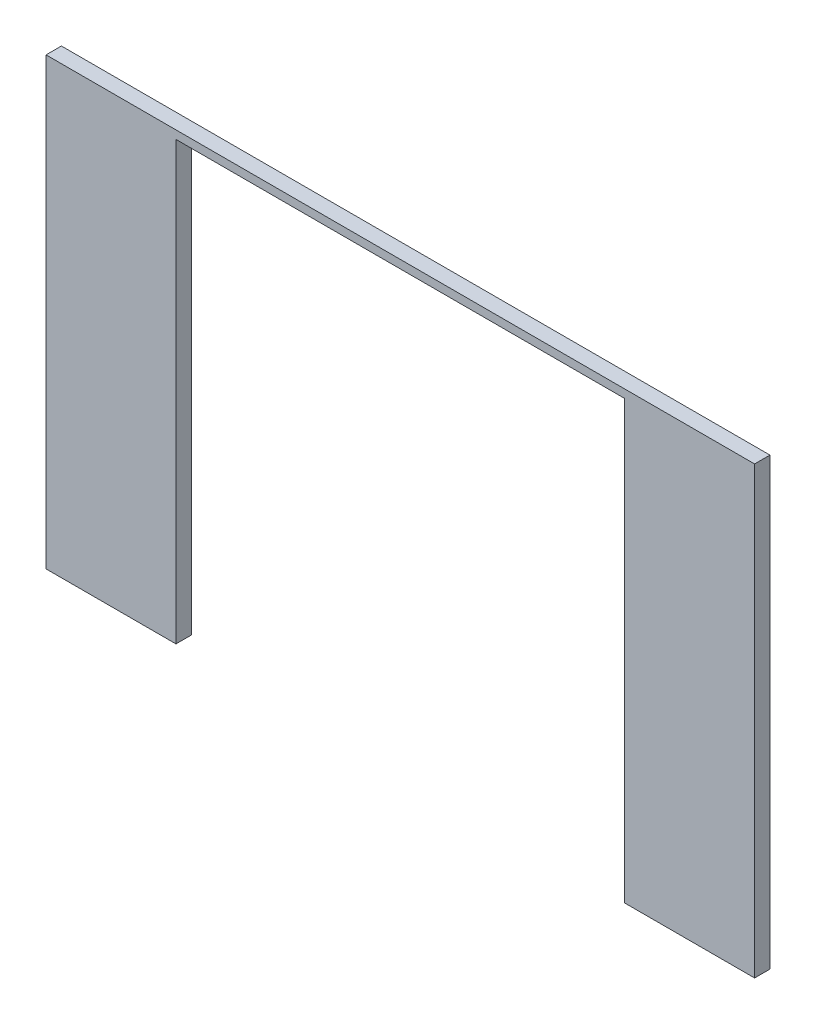
ISO-10303-21;
HEADER;
FILE_DESCRIPTION(('STEP AP214'),'2;1');
FILE_NAME('part.step','',(''),(''),'','','');
FILE_SCHEMA(('AUTOMOTIVE_DESIGN { 1 0 10303 214 1 1 1 1 }'));
ENDSEC;
DATA;
#1=APPLICATION_CONTEXT('core data for automotive mechanical design processes');
#2=APPLICATION_PROTOCOL_DEFINITION('international standard','automotive_design',2000,#1);
#3=PRODUCT_CONTEXT('',#1,'mechanical');
#4=PRODUCT('Part','Part','',(#3));
#5=PRODUCT_RELATED_PRODUCT_CATEGORY('part','',(#4));
#6=PRODUCT_DEFINITION_FORMATION('','',#4);
#7=PRODUCT_DEFINITION_CONTEXT('part definition',#1,'design');
#8=PRODUCT_DEFINITION('design','',#6,#7);
#9=PRODUCT_DEFINITION_SHAPE('','',#8);
#10=(LENGTH_UNIT() NAMED_UNIT(*) SI_UNIT(.MILLI.,.METRE.));
#11=(NAMED_UNIT(*) PLANE_ANGLE_UNIT() SI_UNIT($,.RADIAN.));
#12=(NAMED_UNIT(*) SI_UNIT($,.STERADIAN.) SOLID_ANGLE_UNIT());
#13=UNCERTAINTY_MEASURE_WITH_UNIT(LENGTH_MEASURE(1.E-05),#10,'distance_accuracy_value','');
#14=(GEOMETRIC_REPRESENTATION_CONTEXT(3) GLOBAL_UNCERTAINTY_ASSIGNED_CONTEXT((#13)) GLOBAL_UNIT_ASSIGNED_CONTEXT((#10,
#11,#12)) REPRESENTATION_CONTEXT('',''));
#15=CARTESIAN_POINT('',(0.,0.,0.));
#16=DIRECTION('',(0.,0.,1.));
#17=DIRECTION('',(1.,0.,0.));
#18=AXIS2_PLACEMENT_3D('',#15,#16,#17);
#19=CARTESIAN_POINT('',(7.30769230769232,-15.,0.5));
#20=DIRECTION('',(0.,1.,0.));
#21=DIRECTION('',(0.,0.,1.));
#22=AXIS2_PLACEMENT_3D('',#19,#20,#21);
#23=PLANE('',#22);
#24=DIRECTION('',(1.,0.,0.));
#25=VECTOR('',#24,1.);
#26=CARTESIAN_POINT('',(7.30769230769232,-15.,0.));
#27=LINE('',#26,#25);
#28=CARTESIAN_POINT('',(7.30769230769232,-15.,0.));
#29=VERTEX_POINT('',#28);
#30=CARTESIAN_POINT('',(11.5384615384616,-15.,0.));
#31=VERTEX_POINT('',#30);
#32=EDGE_CURVE('E122',#29,#31,#27,.T.);
#33=ORIENTED_EDGE('',*,*,#32,.T.);
#34=DIRECTION('',(0.,0.,-1.));
#35=VECTOR('',#34,1.);
#36=CARTESIAN_POINT('',(11.5384615384616,-15.,0.5));
#37=LINE('',#36,#35);
#38=CARTESIAN_POINT('',(11.5384615384616,-15.,0.5));
#39=VERTEX_POINT('',#38);
#40=EDGE_CURVE('E48',#39,#31,#37,.T.);
#41=ORIENTED_EDGE('',*,*,#40,.F.);
#42=DIRECTION('',(1.,0.,0.));
#43=VECTOR('',#42,1.);
#44=CARTESIAN_POINT('',(7.30769230769232,-15.,0.5));
#45=LINE('',#44,#43);
#46=CARTESIAN_POINT('',(7.30769230769232,-15.,0.5));
#47=VERTEX_POINT('',#46);
#48=EDGE_CURVE('E119',#47,#39,#45,.T.);
#49=ORIENTED_EDGE('',*,*,#48,.F.);
#50=DIRECTION('',(0.,0.,-1.));
#51=VECTOR('',#50,1.);
#52=CARTESIAN_POINT('',(7.30769230769232,-15.,0.5));
#53=LINE('',#52,#51);
#54=EDGE_CURVE('E115',#47,#29,#53,.T.);
#55=ORIENTED_EDGE('',*,*,#54,.T.);
#56=EDGE_LOOP('',(#33,#41,#49,#55));
#57=FACE_BOUND('',#56,.T.);
#58=ADVANCED_FACE('F39',(#57),#23,.F.);
#59=CARTESIAN_POINT('',(7.30769230769232,-0.76923076923077,0.5));
#60=DIRECTION('',(1.,0.,0.));
#61=DIRECTION('',(0.,0.,-1.));
#62=AXIS2_PLACEMENT_3D('',#59,#60,#61);
#63=PLANE('',#62);
#64=DIRECTION('',(0.,-1.,0.));
#65=VECTOR('',#64,1.);
#66=CARTESIAN_POINT('',(7.30769230769232,-0.76923076923077,0.));
#67=LINE('',#66,#65);
#68=CARTESIAN_POINT('',(7.30769230769232,-0.76923076923077,0.));
#69=VERTEX_POINT('',#68);
#70=EDGE_CURVE('E110',#69,#29,#67,.T.);
#71=ORIENTED_EDGE('',*,*,#70,.T.);
#72=ORIENTED_EDGE('',*,*,#54,.F.);
#73=DIRECTION('',(0.,-1.,0.));
#74=VECTOR('',#73,1.);
#75=CARTESIAN_POINT('',(7.30769230769232,-0.76923076923077,0.5));
#76=LINE('',#75,#74);
#77=CARTESIAN_POINT('',(7.30769230769232,-0.76923076923077,0.5));
#78=VERTEX_POINT('',#77);
#79=EDGE_CURVE('E125',#78,#47,#76,.T.);
#80=ORIENTED_EDGE('',*,*,#79,.F.);
#81=DIRECTION('',(0.,0.,-1.));
#82=VECTOR('',#81,1.);
#83=CARTESIAN_POINT('',(7.30769230769232,-0.76923076923077,0.5));
#84=LINE('',#83,#82);
#85=EDGE_CURVE('E114',#78,#69,#84,.T.);
#86=ORIENTED_EDGE('',*,*,#85,.T.);
#87=EDGE_LOOP('',(#71,#72,#80,#86));
#88=FACE_BOUND('',#87,.T.);
#89=ADVANCED_FACE('F108',(#88),#63,.F.);
#90=CARTESIAN_POINT('',(-7.30769230769229,-0.76923076923077,0.5));
#91=DIRECTION('',(0.,1.,0.));
#92=DIRECTION('',(0.,0.,1.));
#93=AXIS2_PLACEMENT_3D('',#90,#91,#92);
#94=PLANE('',#93);
#95=DIRECTION('',(1.,0.,0.));
#96=VECTOR('',#95,1.);
#97=CARTESIAN_POINT('',(-7.30769230769229,-0.76923076923077,0.));
#98=LINE('',#97,#96);
#99=CARTESIAN_POINT('',(-7.30769230769229,-0.76923076923077,0.));
#100=VERTEX_POINT('',#99);
#101=EDGE_CURVE('E105',#100,#69,#98,.T.);
#102=ORIENTED_EDGE('',*,*,#101,.T.);
#103=ORIENTED_EDGE('',*,*,#85,.F.);
#104=DIRECTION('',(1.,0.,0.));
#105=VECTOR('',#104,1.);
#106=CARTESIAN_POINT('',(-7.30769230769229,-0.76923076923077,0.5));
#107=LINE('',#106,#105);
#108=CARTESIAN_POINT('',(-7.30769230769229,-0.76923076923077,0.5));
#109=VERTEX_POINT('',#108);
#110=EDGE_CURVE('E167',#109,#78,#107,.T.);
#111=ORIENTED_EDGE('',*,*,#110,.F.);
#112=DIRECTION('',(0.,0.,-1.));
#113=VECTOR('',#112,1.);
#114=CARTESIAN_POINT('',(-7.30769230769229,-0.76923076923077,0.5));
#115=LINE('',#114,#113);
#116=EDGE_CURVE('E143',#109,#100,#115,.T.);
#117=ORIENTED_EDGE('',*,*,#116,.T.);
#118=EDGE_LOOP('',(#102,#103,#111,#117));
#119=FACE_BOUND('',#118,.T.);
#120=ADVANCED_FACE('F173',(#119),#94,.F.);
#121=CARTESIAN_POINT('',(-7.30769230769229,-15.,0.5));
#122=DIRECTION('',(-1.,0.,0.));
#123=DIRECTION('',(0.,0.,1.));
#124=AXIS2_PLACEMENT_3D('',#121,#122,#123);
#125=PLANE('',#124);
#126=DIRECTION('',(0.,1.,0.));
#127=VECTOR('',#126,1.);
#128=CARTESIAN_POINT('',(-7.30769230769229,-15.,0.));
#129=LINE('',#128,#127);
#130=CARTESIAN_POINT('',(-7.30769230769229,-15.,0.));
#131=VERTEX_POINT('',#130);
#132=EDGE_CURVE('E139',#131,#100,#129,.T.);
#133=ORIENTED_EDGE('',*,*,#132,.T.);
#134=ORIENTED_EDGE('',*,*,#116,.F.);
#135=DIRECTION('',(0.,1.,0.));
#136=VECTOR('',#135,1.);
#137=CARTESIAN_POINT('',(-7.30769230769229,-15.,0.5));
#138=LINE('',#137,#136);
#139=CARTESIAN_POINT('',(-7.30769230769229,-15.,0.5));
#140=VERTEX_POINT('',#139);
#141=EDGE_CURVE('E168',#140,#109,#138,.T.);
#142=ORIENTED_EDGE('',*,*,#141,.F.);
#143=DIRECTION('',(0.,0.,-1.));
#144=VECTOR('',#143,1.);
#145=CARTESIAN_POINT('',(-7.30769230769229,-15.,0.5));
#146=LINE('',#145,#144);
#147=EDGE_CURVE('E147',#140,#131,#146,.T.);
#148=ORIENTED_EDGE('',*,*,#147,.T.);
#149=EDGE_LOOP('',(#133,#134,#142,#148));
#150=FACE_BOUND('',#149,.T.);
#151=ADVANCED_FACE('F171',(#150),#125,.F.);
#152=CARTESIAN_POINT('',(-11.5384615384615,-15.,0.5));
#153=DIRECTION('',(0.,1.,0.));
#154=DIRECTION('',(0.,0.,1.));
#155=AXIS2_PLACEMENT_3D('',#152,#153,#154);
#156=PLANE('',#155);
#157=DIRECTION('',(1.,0.,0.));
#158=VECTOR('',#157,1.);
#159=CARTESIAN_POINT('',(-11.5384615384615,-15.,0.));
#160=LINE('',#159,#158);
#161=CARTESIAN_POINT('',(-11.5384615384615,-15.,0.));
#162=VERTEX_POINT('',#161);
#163=EDGE_CURVE('E138',#162,#131,#160,.T.);
#164=ORIENTED_EDGE('',*,*,#163,.T.);
#165=ORIENTED_EDGE('',*,*,#147,.F.);
#166=DIRECTION('',(1.,0.,0.));
#167=VECTOR('',#166,1.);
#168=CARTESIAN_POINT('',(-11.5384615384615,-15.,0.5));
#169=LINE('',#168,#167);
#170=CARTESIAN_POINT('',(-11.5384615384615,-15.,0.5));
#171=VERTEX_POINT('',#170);
#172=EDGE_CURVE('E161',#171,#140,#169,.T.);
#173=ORIENTED_EDGE('',*,*,#172,.F.);
#174=DIRECTION('',(0.,0.,-1.));
#175=VECTOR('',#174,1.);
#176=CARTESIAN_POINT('',(-11.5384615384615,-15.,0.5));
#177=LINE('',#176,#175);
#178=EDGE_CURVE('E146',#171,#162,#177,.T.);
#179=ORIENTED_EDGE('',*,*,#178,.T.);
#180=EDGE_LOOP('',(#164,#165,#173,#179));
#181=FACE_BOUND('',#180,.T.);
#182=ADVANCED_FACE('F179',(#181),#156,.F.);
#183=CARTESIAN_POINT('',(0.,0.,0.5));
#184=DIRECTION('',(0.,0.,1.));
#185=DIRECTION('',(1.,0.,0.));
#186=AXIS2_PLACEMENT_3D('',#183,#184,#185);
#187=PLANE('',#186);
#188=DIRECTION('',(1.,0.,0.));
#189=VECTOR('',#188,1.);
#190=CARTESIAN_POINT('',(0.,-0.5,0.5));
#191=LINE('',#190,#189);
#192=CARTESIAN_POINT('',(-11.5384615384615,-0.5,0.5));
#193=VERTEX_POINT('',#192);
#194=CARTESIAN_POINT('',(11.5384615384616,-0.5,0.5));
#195=VERTEX_POINT('',#194);
#196=EDGE_CURVE('E11',#193,#195,#191,.T.);
#197=ORIENTED_EDGE('',*,*,#196,.F.);
#198=DIRECTION('',(0.,-1.,0.));
#199=VECTOR('',#198,1.);
#200=CARTESIAN_POINT('',(-11.5384615384615,15.,0.5));
#201=LINE('',#200,#199);
#202=EDGE_CURVE('E160',#193,#171,#201,.T.);
#203=ORIENTED_EDGE('',*,*,#202,.T.);
#204=ORIENTED_EDGE('',*,*,#172,.T.);
#205=ORIENTED_EDGE('',*,*,#141,.T.);
#206=ORIENTED_EDGE('',*,*,#110,.T.);
#207=ORIENTED_EDGE('',*,*,#79,.T.);
#208=ORIENTED_EDGE('',*,*,#48,.T.);
#209=DIRECTION('',(0.,1.,0.));
#210=VECTOR('',#209,1.);
#211=CARTESIAN_POINT('',(11.5384615384616,-15.,0.5));
#212=LINE('',#211,#210);
#213=EDGE_CURVE('E153',#39,#195,#212,.T.);
#214=ORIENTED_EDGE('',*,*,#213,.T.);
#215=EDGE_LOOP('',(#197,#203,#204,#205,#206,#207,#208,#214));
#216=FACE_BOUND('',#215,.T.);
#217=ADVANCED_FACE('F159',(#216),#187,.T.);
#218=CARTESIAN_POINT('',(-11.5384615384615,15.,0.5));
#219=DIRECTION('',(1.,0.,0.));
#220=DIRECTION('',(0.,0.,-1.));
#221=AXIS2_PLACEMENT_3D('',#218,#219,#220);
#222=PLANE('',#221);
#223=ORIENTED_EDGE('',*,*,#202,.F.);
#224=DIRECTION('',(0.,0.,-1.));
#225=VECTOR('',#224,1.);
#226=CARTESIAN_POINT('',(-11.5384615384615,-0.5,0.5));
#227=LINE('',#226,#225);
#228=CARTESIAN_POINT('',(-11.5384615384615,-0.5,0.));
#229=VERTEX_POINT('',#228);
#230=EDGE_CURVE('E54',#193,#229,#227,.T.);
#231=ORIENTED_EDGE('',*,*,#230,.T.);
#232=DIRECTION('',(0.,-1.,0.));
#233=VECTOR('',#232,1.);
#234=CARTESIAN_POINT('',(-11.5384615384615,15.,0.));
#235=LINE('',#234,#233);
#236=EDGE_CURVE('E131',#229,#162,#235,.T.);
#237=ORIENTED_EDGE('',*,*,#236,.T.);
#238=ORIENTED_EDGE('',*,*,#178,.F.);
#239=EDGE_LOOP('',(#223,#231,#237,#238));
#240=FACE_BOUND('',#239,.T.);
#241=ADVANCED_FACE('F217',(#240),#222,.F.);
#242=CARTESIAN_POINT('',(11.5384615384616,-15.,0.5));
#243=DIRECTION('',(-1.,0.,0.));
#244=DIRECTION('',(0.,0.,1.));
#245=AXIS2_PLACEMENT_3D('',#242,#243,#244);
#246=PLANE('',#245);
#247=DIRECTION('',(0.,1.,0.));
#248=VECTOR('',#247,1.);
#249=CARTESIAN_POINT('',(11.5384615384616,-15.,0.));
#250=LINE('',#249,#248);
#251=CARTESIAN_POINT('',(11.5384615384616,-0.5,0.));
#252=VERTEX_POINT('',#251);
#253=EDGE_CURVE('E126',#31,#252,#250,.T.);
#254=ORIENTED_EDGE('',*,*,#253,.T.);
#255=DIRECTION('',(0.,0.,1.));
#256=VECTOR('',#255,1.);
#257=CARTESIAN_POINT('',(11.5384615384616,-0.5,0.5));
#258=LINE('',#257,#256);
#259=EDGE_CURVE('E67',#252,#195,#258,.T.);
#260=ORIENTED_EDGE('',*,*,#259,.T.);
#261=ORIENTED_EDGE('',*,*,#213,.F.);
#262=ORIENTED_EDGE('',*,*,#40,.T.);
#263=EDGE_LOOP('',(#254,#260,#261,#262));
#264=FACE_BOUND('',#263,.T.);
#265=ADVANCED_FACE('F155',(#264),#246,.F.);
#266=CARTESIAN_POINT('',(0.,0.,0.));
#267=DIRECTION('',(0.,0.,1.));
#268=DIRECTION('',(1.,0.,0.));
#269=AXIS2_PLACEMENT_3D('',#266,#267,#268);
#270=PLANE('',#269);
#271=DIRECTION('',(-1.,0.,0.));
#272=VECTOR('',#271,1.);
#273=CARTESIAN_POINT('',(-17.,-0.5,0.));
#274=LINE('',#273,#272);
#275=EDGE_CURVE('E45',#252,#229,#274,.T.);
#276=ORIENTED_EDGE('',*,*,#275,.F.);
#277=ORIENTED_EDGE('',*,*,#253,.F.);
#278=ORIENTED_EDGE('',*,*,#32,.F.);
#279=ORIENTED_EDGE('',*,*,#70,.F.);
#280=ORIENTED_EDGE('',*,*,#101,.F.);
#281=ORIENTED_EDGE('',*,*,#132,.F.);
#282=ORIENTED_EDGE('',*,*,#163,.F.);
#283=ORIENTED_EDGE('',*,*,#236,.F.);
#284=EDGE_LOOP('',(#276,#277,#278,#279,#280,#281,#282,#283));
#285=FACE_BOUND('',#284,.T.);
#286=ADVANCED_FACE('F128',(#285),#270,.F.);
#287=CARTESIAN_POINT('',(-17.,-0.5,1.));
#288=DIRECTION('',(0.,-1.,0.));
#289=DIRECTION('',(0.,0.,-1.));
#290=AXIS2_PLACEMENT_3D('',#287,#288,#289);
#291=PLANE('',#290);
#292=ORIENTED_EDGE('',*,*,#275,.T.);
#293=ORIENTED_EDGE('',*,*,#230,.F.);
#294=ORIENTED_EDGE('',*,*,#196,.T.);
#295=ORIENTED_EDGE('',*,*,#259,.F.);
#296=EDGE_LOOP('',(#292,#293,#294,#295));
#297=FACE_BOUND('',#296,.T.);
#298=ADVANCED_FACE('F302',(#297),#291,.F.);
#299=CLOSED_SHELL('',(#58,#89,#120,#151,#182,#217,#241,#265,#286,#298));
#300=MANIFOLD_SOLID_BREP('B2',#299);
#301=ADVANCED_BREP_SHAPE_REPRESENTATION('',(#18,#300),#14);
#302=SHAPE_DEFINITION_REPRESENTATION(#9,#301);
ENDSEC;
END-ISO-10303-21;
